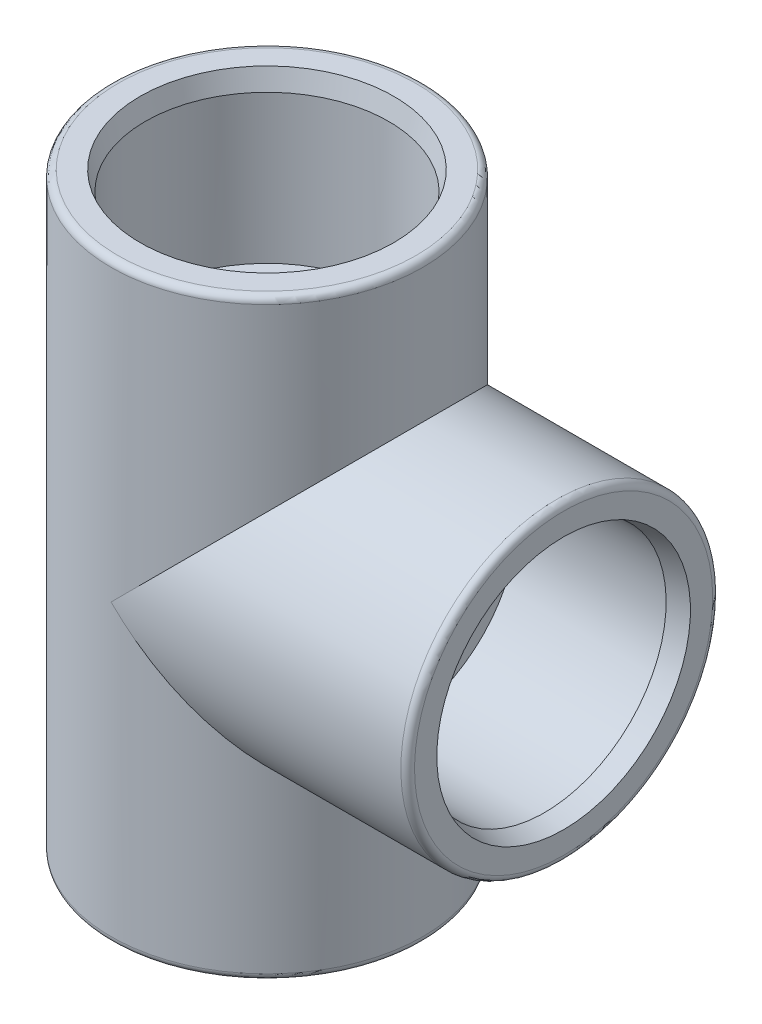
ISO-10303-21;
HEADER;
FILE_DESCRIPTION(('STEP AP214'),'2;1');
FILE_NAME('part.step','',(''),(''),'','','');
FILE_SCHEMA(('AUTOMOTIVE_DESIGN { 1 0 10303 214 1 1 1 1 }'));
ENDSEC;
DATA;
#1=APPLICATION_CONTEXT('core data for automotive mechanical design processes');
#2=APPLICATION_PROTOCOL_DEFINITION('international standard','automotive_design',2000,#1);
#3=PRODUCT_CONTEXT('',#1,'mechanical');
#4=PRODUCT('Part','Part','',(#3));
#5=PRODUCT_RELATED_PRODUCT_CATEGORY('part','',(#4));
#6=PRODUCT_DEFINITION_FORMATION('','',#4);
#7=PRODUCT_DEFINITION_CONTEXT('part definition',#1,'design');
#8=PRODUCT_DEFINITION('design','',#6,#7);
#9=PRODUCT_DEFINITION_SHAPE('','',#8);
#10=(LENGTH_UNIT() NAMED_UNIT(*) SI_UNIT(.MILLI.,.METRE.));
#11=(NAMED_UNIT(*) PLANE_ANGLE_UNIT() SI_UNIT($,.RADIAN.));
#12=(NAMED_UNIT(*) SI_UNIT($,.STERADIAN.) SOLID_ANGLE_UNIT());
#13=UNCERTAINTY_MEASURE_WITH_UNIT(LENGTH_MEASURE(1.E-05),#10,'distance_accuracy_value','');
#14=(GEOMETRIC_REPRESENTATION_CONTEXT(3) GLOBAL_UNCERTAINTY_ASSIGNED_CONTEXT((#13)) GLOBAL_UNIT_ASSIGNED_CONTEXT((#10,
#11,#12)) REPRESENTATION_CONTEXT('',''));
#15=CARTESIAN_POINT('',(0.,0.,0.));
#16=DIRECTION('',(0.,0.,1.));
#17=DIRECTION('',(1.,0.,0.));
#18=AXIS2_PLACEMENT_3D('',#15,#16,#17);
#19=CARTESIAN_POINT('',(0.,78.,0.));
#20=DIRECTION('',(0.,1.,0.));
#21=DIRECTION('',(1.,0.,0.));
#22=AXIS2_PLACEMENT_3D('',#19,#20,#21);
#23=PLANE('',#22);
#24=CARTESIAN_POINT('',(0.,78.,0.));
#25=DIRECTION('',(0.,1.,0.));
#26=DIRECTION('',(1.,0.,0.));
#27=AXIS2_PLACEMENT_3D('',#24,#25,#26);
#28=CIRCLE('',#27,19.6);
#29=CARTESIAN_POINT('',(19.6,78.,0.));
#30=VERTEX_POINT('',#29);
#31=EDGE_CURVE('E107',#30,#30,#28,.T.);
#32=ORIENTED_EDGE('',*,*,#31,.T.);
#33=EDGE_LOOP('',(#32));
#34=FACE_BOUND('',#33,.T.);
#35=CARTESIAN_POINT('',(0.,78.,0.));
#36=DIRECTION('',(0.,-1.,0.));
#37=DIRECTION('',(-1.,0.,0.));
#38=AXIS2_PLACEMENT_3D('',#35,#36,#37);
#39=CIRCLE('',#38,16.675);
#40=CARTESIAN_POINT('',(-16.675,78.,0.));
#41=VERTEX_POINT('',#40);
#42=EDGE_CURVE('E113',#41,#41,#39,.T.);
#43=ORIENTED_EDGE('',*,*,#42,.T.);
#44=EDGE_LOOP('',(#43));
#45=FACE_BOUND('',#44,.T.);
#46=ADVANCED_FACE('F16',(#34,#45),#23,.T.);
#47=CARTESIAN_POINT('',(0.,0.,0.));
#48=DIRECTION('',(0.,-1.,0.));
#49=DIRECTION('',(-1.,0.,0.));
#50=AXIS2_PLACEMENT_3D('',#47,#48,#49);
#51=PLANE('',#50);
#52=CARTESIAN_POINT('',(0.,0.,0.));
#53=DIRECTION('',(0.,-1.,0.));
#54=DIRECTION('',(-1.,0.,0.));
#55=AXIS2_PLACEMENT_3D('',#52,#53,#54);
#56=CIRCLE('',#55,19.6);
#57=CARTESIAN_POINT('',(-19.6,0.,0.));
#58=VERTEX_POINT('',#57);
#59=EDGE_CURVE('E74',#58,#58,#56,.T.);
#60=ORIENTED_EDGE('',*,*,#59,.T.);
#61=EDGE_LOOP('',(#60));
#62=FACE_BOUND('',#61,.T.);
#63=CARTESIAN_POINT('',(0.,0.,0.));
#64=DIRECTION('',(0.,1.,0.));
#65=DIRECTION('',(1.,0.,0.));
#66=AXIS2_PLACEMENT_3D('',#63,#64,#65);
#67=CIRCLE('',#66,16.675);
#68=CARTESIAN_POINT('',(16.675,0.,0.));
#69=VERTEX_POINT('',#68);
#70=EDGE_CURVE('E91',#69,#69,#67,.T.);
#71=ORIENTED_EDGE('',*,*,#70,.T.);
#72=EDGE_LOOP('',(#71));
#73=FACE_BOUND('',#72,.T.);
#74=ADVANCED_FACE('F75',(#62,#73),#51,.T.);
#75=CARTESIAN_POINT('',(39.,39.,0.));
#76=DIRECTION('',(1.,0.,0.));
#77=DIRECTION('',(0.,0.,-1.));
#78=AXIS2_PLACEMENT_3D('',#75,#76,#77);
#79=PLANE('',#78);
#80=CARTESIAN_POINT('',(39.,39.,0.));
#81=DIRECTION('',(1.,0.,0.));
#82=DIRECTION('',(0.,-1.,0.));
#83=AXIS2_PLACEMENT_3D('',#80,#81,#82);
#84=CIRCLE('',#83,19.6);
#85=CARTESIAN_POINT('',(39.,19.4,0.));
#86=VERTEX_POINT('',#85);
#87=EDGE_CURVE('E79',#86,#86,#84,.T.);
#88=ORIENTED_EDGE('',*,*,#87,.T.);
#89=EDGE_LOOP('',(#88));
#90=FACE_BOUND('',#89,.T.);
#91=CARTESIAN_POINT('',(39.,39.,0.));
#92=DIRECTION('',(-1.,0.,0.));
#93=DIRECTION('',(0.,1.,0.));
#94=AXIS2_PLACEMENT_3D('',#91,#92,#93);
#95=CIRCLE('',#94,16.675);
#96=CARTESIAN_POINT('',(39.,55.675,0.));
#97=VERTEX_POINT('',#96);
#98=EDGE_CURVE('E92',#97,#97,#95,.T.);
#99=ORIENTED_EDGE('',*,*,#98,.T.);
#100=EDGE_LOOP('',(#99));
#101=FACE_BOUND('',#100,.T.);
#102=ADVANCED_FACE('F146',(#90,#101),#79,.T.);
#103=CARTESIAN_POINT('',(0.,39.,0.));
#104=DIRECTION('',(0.,-1.,0.));
#105=DIRECTION('',(1.,0.,0.));
#106=AXIS2_PLACEMENT_3D('',#103,#104,#105);
#107=CYLINDRICAL_SURFACE('',#106,12.8);
#108=CARTESIAN_POINT('',(0.,22.,0.));
#109=DIRECTION('',(0.,-1.,0.));
#110=DIRECTION('',(1.,0.,0.));
#111=AXIS2_PLACEMENT_3D('',#108,#109,#110);
#112=CIRCLE('',#111,12.8);
#113=CARTESIAN_POINT('',(-12.8,22.,0.));
#114=VERTEX_POINT('',#113);
#115=EDGE_CURVE('E11',#114,#114,#112,.T.);
#116=ORIENTED_EDGE('',*,*,#115,.T.);
#117=EDGE_LOOP('',(#116));
#118=FACE_BOUND('',#117,.T.);
#119=CARTESIAN_POINT('',(0.,56.,0.));
#120=DIRECTION('',(0.,1.,0.));
#121=DIRECTION('',(1.,0.,0.));
#122=AXIS2_PLACEMENT_3D('',#119,#120,#121);
#123=CIRCLE('',#122,12.8);
#124=CARTESIAN_POINT('',(-12.8,56.,0.));
#125=VERTEX_POINT('',#124);
#126=EDGE_CURVE('E106',#125,#125,#123,.T.);
#127=ORIENTED_EDGE('',*,*,#126,.T.);
#128=EDGE_LOOP('',(#127));
#129=FACE_BOUND('',#128,.T.);
#130=CARTESIAN_POINT('',(0.,39.,0.));
#131=DIRECTION('',(0.707106781186548,-0.707106781186548,0.));
#132=DIRECTION('',(0.707106781186548,0.707106781186548,0.));
#133=AXIS2_PLACEMENT_3D('',#130,#131,#132);
#134=ELLIPSE('',#133,18.1019335983756,12.8);
#135=CARTESIAN_POINT('',(0.,39.,-12.8));
#136=VERTEX_POINT('',#135);
#137=CARTESIAN_POINT('',(0.,39.,12.8));
#138=VERTEX_POINT('',#137);
#139=EDGE_CURVE('E97',#136,#138,#134,.T.);
#140=ORIENTED_EDGE('',*,*,#139,.T.);
#141=CARTESIAN_POINT('',(0.,39.,0.));
#142=DIRECTION('',(0.707106781186548,0.707106781186548,0.));
#143=DIRECTION('',(-0.707106781186548,0.707106781186548,0.));
#144=AXIS2_PLACEMENT_3D('',#141,#142,#143);
#145=ELLIPSE('',#144,18.1019335983756,12.8);
#146=EDGE_CURVE('E100',#138,#136,#145,.T.);
#147=ORIENTED_EDGE('',*,*,#146,.T.);
#148=EDGE_LOOP('',(#140,#147));
#149=FACE_BOUND('',#148,.T.);
#150=ADVANCED_FACE('F153',(#118,#129,#149),#107,.F.);
#151=CARTESIAN_POINT('',(0.,22.,0.));
#152=DIRECTION('',(0.,1.,0.));
#153=DIRECTION('',(1.,0.,0.));
#154=AXIS2_PLACEMENT_3D('',#151,#152,#153);
#155=PLANE('',#154);
#156=CARTESIAN_POINT('',(0.,22.,0.));
#157=DIRECTION('',(0.,1.,0.));
#158=DIRECTION('',(1.,0.,0.));
#159=AXIS2_PLACEMENT_3D('',#156,#157,#158);
#160=CIRCLE('',#159,16.);
#161=CARTESIAN_POINT('',(16.,22.,0.));
#162=VERTEX_POINT('',#161);
#163=EDGE_CURVE('E26',#162,#162,#160,.T.);
#164=ORIENTED_EDGE('',*,*,#163,.F.);
#165=EDGE_LOOP('',(#164));
#166=FACE_BOUND('',#165,.T.);
#167=ORIENTED_EDGE('',*,*,#115,.F.);
#168=EDGE_LOOP('',(#167));
#169=FACE_BOUND('',#168,.T.);
#170=ADVANCED_FACE('F18',(#166,#169),#155,.F.);
#171=CARTESIAN_POINT('',(0.,10.5,0.));
#172=DIRECTION('',(0.,-1.,0.));
#173=DIRECTION('',(1.,0.,0.));
#174=AXIS2_PLACEMENT_3D('',#171,#172,#173);
#175=CYLINDRICAL_SURFACE('',#174,16.);
#176=ORIENTED_EDGE('',*,*,#163,.T.);
#177=EDGE_LOOP('',(#176));
#178=FACE_BOUND('',#177,.T.);
#179=CARTESIAN_POINT('',(0.,2.51913429510899,0.));
#180=DIRECTION('',(0.,-1.,0.));
#181=DIRECTION('',(1.,0.,0.));
#182=AXIS2_PLACEMENT_3D('',#179,#180,#181);
#183=CIRCLE('',#182,16.);
#184=CARTESIAN_POINT('',(16.,2.51913429510899,0.));
#185=VERTEX_POINT('',#184);
#186=EDGE_CURVE('E20',#185,#185,#183,.T.);
#187=ORIENTED_EDGE('',*,*,#186,.T.);
#188=EDGE_LOOP('',(#187));
#189=FACE_BOUND('',#188,.T.);
#190=ADVANCED_FACE('F133',(#178,#189),#175,.F.);
#191=CARTESIAN_POINT('',(0.,56.,0.));
#192=DIRECTION('',(0.,-1.,0.));
#193=DIRECTION('',(-1.,0.,0.));
#194=AXIS2_PLACEMENT_3D('',#191,#192,#193);
#195=PLANE('',#194);
#196=CARTESIAN_POINT('',(0.,56.,0.));
#197=DIRECTION('',(0.,-1.,0.));
#198=DIRECTION('',(1.,0.,0.));
#199=AXIS2_PLACEMENT_3D('',#196,#197,#198);
#200=CIRCLE('',#199,16.);
#201=CARTESIAN_POINT('',(16.,56.,0.));
#202=VERTEX_POINT('',#201);
#203=EDGE_CURVE('E119',#202,#202,#200,.T.);
#204=ORIENTED_EDGE('',*,*,#203,.F.);
#205=EDGE_LOOP('',(#204));
#206=FACE_BOUND('',#205,.T.);
#207=ORIENTED_EDGE('',*,*,#126,.F.);
#208=EDGE_LOOP('',(#207));
#209=FACE_BOUND('',#208,.T.);
#210=ADVANCED_FACE('F181',(#206,#209),#195,.F.);
#211=CARTESIAN_POINT('',(0.,67.5,0.));
#212=DIRECTION('',(0.,-1.,0.));
#213=DIRECTION('',(1.,0.,0.));
#214=AXIS2_PLACEMENT_3D('',#211,#212,#213);
#215=CYLINDRICAL_SURFACE('',#214,16.);
#216=ORIENTED_EDGE('',*,*,#203,.T.);
#217=EDGE_LOOP('',(#216));
#218=FACE_BOUND('',#217,.T.);
#219=CARTESIAN_POINT('',(0.,75.480865704891,0.));
#220=DIRECTION('',(0.,1.,0.));
#221=DIRECTION('',(1.,0.,0.));
#222=AXIS2_PLACEMENT_3D('',#219,#220,#221);
#223=CIRCLE('',#222,16.);
#224=CARTESIAN_POINT('',(-16.,75.480865704891,0.));
#225=VERTEX_POINT('',#224);
#226=EDGE_CURVE('E103',#225,#225,#223,.T.);
#227=ORIENTED_EDGE('',*,*,#226,.T.);
#228=EDGE_LOOP('',(#227));
#229=FACE_BOUND('',#228,.T.);
#230=ADVANCED_FACE('F184',(#218,#229),#215,.F.);
#231=CARTESIAN_POINT('',(19.5,39.,0.));
#232=DIRECTION('',(-1.,0.,0.));
#233=DIRECTION('',(0.,0.,-1.));
#234=AXIS2_PLACEMENT_3D('',#231,#232,#233);
#235=CYLINDRICAL_SURFACE('',#234,12.8);
#236=ORIENTED_EDGE('',*,*,#139,.F.);
#237=ORIENTED_EDGE('',*,*,#146,.F.);
#238=EDGE_LOOP('',(#236,#237));
#239=FACE_BOUND('',#238,.T.);
#240=CARTESIAN_POINT('',(17.,39.,0.));
#241=DIRECTION('',(1.,0.,0.));
#242=DIRECTION('',(0.,0.,-1.));
#243=AXIS2_PLACEMENT_3D('',#240,#241,#242);
#244=CIRCLE('',#243,12.8);
#245=CARTESIAN_POINT('',(17.,39.,12.8));
#246=VERTEX_POINT('',#245);
#247=EDGE_CURVE('E81',#246,#246,#244,.T.);
#248=ORIENTED_EDGE('',*,*,#247,.T.);
#249=EDGE_LOOP('',(#248));
#250=FACE_BOUND('',#249,.T.);
#251=ADVANCED_FACE('F179',(#239,#250),#235,.F.);
#252=CARTESIAN_POINT('',(17.,39.,0.));
#253=DIRECTION('',(-1.,0.,0.));
#254=DIRECTION('',(0.,0.,1.));
#255=AXIS2_PLACEMENT_3D('',#252,#253,#254);
#256=PLANE('',#255);
#257=CARTESIAN_POINT('',(17.,39.,0.));
#258=DIRECTION('',(-1.,0.,0.));
#259=DIRECTION('',(0.,0.,1.));
#260=AXIS2_PLACEMENT_3D('',#257,#258,#259);
#261=CIRCLE('',#260,16.);
#262=CARTESIAN_POINT('',(17.,39.,16.));
#263=VERTEX_POINT('',#262);
#264=EDGE_CURVE('E78',#263,#263,#261,.T.);
#265=ORIENTED_EDGE('',*,*,#264,.F.);
#266=EDGE_LOOP('',(#265));
#267=FACE_BOUND('',#266,.T.);
#268=ORIENTED_EDGE('',*,*,#247,.F.);
#269=EDGE_LOOP('',(#268));
#270=FACE_BOUND('',#269,.T.);
#271=ADVANCED_FACE('F175',(#267,#270),#256,.F.);
#272=CARTESIAN_POINT('',(28.5,39.,0.));
#273=DIRECTION('',(1.,0.,0.));
#274=DIRECTION('',(0.,0.,1.));
#275=AXIS2_PLACEMENT_3D('',#272,#273,#274);
#276=CYLINDRICAL_SURFACE('',#275,16.);
#277=ORIENTED_EDGE('',*,*,#264,.T.);
#278=EDGE_LOOP('',(#277));
#279=FACE_BOUND('',#278,.T.);
#280=CARTESIAN_POINT('',(36.480865704891,39.,0.));
#281=DIRECTION('',(1.,0.,0.));
#282=DIRECTION('',(0.,0.,1.));
#283=AXIS2_PLACEMENT_3D('',#280,#281,#282);
#284=CIRCLE('',#283,16.);
#285=CARTESIAN_POINT('',(36.480865704891,55.,0.));
#286=VERTEX_POINT('',#285);
#287=EDGE_CURVE('E88',#286,#286,#284,.T.);
#288=ORIENTED_EDGE('',*,*,#287,.T.);
#289=EDGE_LOOP('',(#288));
#290=FACE_BOUND('',#289,.T.);
#291=ADVANCED_FACE('F178',(#279,#290),#276,.F.);
#292=CARTESIAN_POINT('',(0.,0.9,0.));
#293=DIRECTION('',(0.,-1.,0.));
#294=DIRECTION('',(0.,0.,1.));
#295=AXIS2_PLACEMENT_3D('',#292,#293,#294);
#296=TOROIDAL_SURFACE('',#295,19.6,0.9);
#297=ORIENTED_EDGE('',*,*,#59,.F.);
#298=EDGE_LOOP('',(#297));
#299=FACE_BOUND('',#298,.T.);
#300=CARTESIAN_POINT('',(0.,0.9,0.));
#301=DIRECTION('',(0.,1.,0.));
#302=DIRECTION('',(1.,0.,0.));
#303=AXIS2_PLACEMENT_3D('',#300,#301,#302);
#304=CIRCLE('',#303,20.5);
#305=CARTESIAN_POINT('',(-20.5,0.9,0.));
#306=VERTEX_POINT('',#305);
#307=EDGE_CURVE('E95',#306,#306,#304,.T.);
#308=ORIENTED_EDGE('',*,*,#307,.F.);
#309=EDGE_LOOP('',(#308));
#310=FACE_BOUND('',#309,.T.);
#311=ADVANCED_FACE('F166',(#299,#310),#296,.T.);
#312=CARTESIAN_POINT('',(19.5,39.,0.));
#313=DIRECTION('',(-1.,0.,0.));
#314=DIRECTION('',(0.,0.,-1.));
#315=AXIS2_PLACEMENT_3D('',#312,#313,#314);
#316=CYLINDRICAL_SURFACE('',#315,20.5);
#317=CARTESIAN_POINT('',(38.1,39.,0.));
#318=DIRECTION('',(1.,0.,0.));
#319=DIRECTION('',(0.,0.,-1.));
#320=AXIS2_PLACEMENT_3D('',#317,#318,#319);
#321=CIRCLE('',#320,20.5);
#322=CARTESIAN_POINT('',(38.1,18.5,0.));
#323=VERTEX_POINT('',#322);
#324=EDGE_CURVE('E83',#323,#323,#321,.T.);
#325=ORIENTED_EDGE('',*,*,#324,.F.);
#326=EDGE_LOOP('',(#325));
#327=FACE_BOUND('',#326,.T.);
#328=CARTESIAN_POINT('',(0.,39.,0.));
#329=DIRECTION('',(-0.707106781186548,-0.707106781186548,0.));
#330=DIRECTION('',(-0.707106781186548,0.707106781186548,0.));
#331=AXIS2_PLACEMENT_3D('',#328,#329,#330);
#332=ELLIPSE('',#331,28.9913780286485,20.5);
#333=CARTESIAN_POINT('',(0.,39.,-20.5));
#334=VERTEX_POINT('',#333);
#335=CARTESIAN_POINT('',(0.,39.,20.5));
#336=VERTEX_POINT('',#335);
#337=EDGE_CURVE('E93',#334,#336,#332,.T.);
#338=ORIENTED_EDGE('',*,*,#337,.F.);
#339=CARTESIAN_POINT('',(0.,39.,0.));
#340=DIRECTION('',(-0.707106781186548,0.707106781186548,0.));
#341=DIRECTION('',(0.707106781186548,0.707106781186548,0.));
#342=AXIS2_PLACEMENT_3D('',#339,#340,#341);
#343=ELLIPSE('',#342,28.9913780286485,20.5);
#344=EDGE_CURVE('E87',#336,#334,#343,.T.);
#345=ORIENTED_EDGE('',*,*,#344,.F.);
#346=EDGE_LOOP('',(#338,#345));
#347=FACE_BOUND('',#346,.T.);
#348=ADVANCED_FACE('F162',(#327,#347),#316,.T.);
#349=CARTESIAN_POINT('',(38.1,39.,0.));
#350=DIRECTION('',(1.,0.,0.));
#351=DIRECTION('',(0.,0.,1.));
#352=AXIS2_PLACEMENT_3D('',#349,#350,#351);
#353=TOROIDAL_SURFACE('',#352,19.6,0.9);
#354=ORIENTED_EDGE('',*,*,#87,.F.);
#355=EDGE_LOOP('',(#354));
#356=FACE_BOUND('',#355,.T.);
#357=ORIENTED_EDGE('',*,*,#324,.T.);
#358=EDGE_LOOP('',(#357));
#359=FACE_BOUND('',#358,.T.);
#360=ADVANCED_FACE('F165',(#356,#359),#353,.T.);
#361=CARTESIAN_POINT('',(0.,39.,0.));
#362=DIRECTION('',(0.,-1.,0.));
#363=DIRECTION('',(1.,0.,0.));
#364=AXIS2_PLACEMENT_3D('',#361,#362,#363);
#365=CYLINDRICAL_SURFACE('',#364,20.5);
#366=CARTESIAN_POINT('',(0.,77.1,0.));
#367=DIRECTION('',(0.,1.,0.));
#368=DIRECTION('',(1.,0.,0.));
#369=AXIS2_PLACEMENT_3D('',#366,#367,#368);
#370=CIRCLE('',#369,20.5);
#371=CARTESIAN_POINT('',(20.5,77.1,0.));
#372=VERTEX_POINT('',#371);
#373=EDGE_CURVE('E108',#372,#372,#370,.T.);
#374=ORIENTED_EDGE('',*,*,#373,.F.);
#375=EDGE_LOOP('',(#374));
#376=FACE_BOUND('',#375,.T.);
#377=ORIENTED_EDGE('',*,*,#307,.T.);
#378=EDGE_LOOP('',(#377));
#379=FACE_BOUND('',#378,.T.);
#380=ORIENTED_EDGE('',*,*,#344,.T.);
#381=ORIENTED_EDGE('',*,*,#337,.T.);
#382=EDGE_LOOP('',(#380,#381));
#383=FACE_BOUND('',#382,.T.);
#384=ADVANCED_FACE('F173',(#376,#379,#383),#365,.T.);
#385=CARTESIAN_POINT('',(0.,77.1,0.));
#386=DIRECTION('',(0.,1.,0.));
#387=DIRECTION('',(0.,0.,1.));
#388=AXIS2_PLACEMENT_3D('',#385,#386,#387);
#389=TOROIDAL_SURFACE('',#388,19.6,0.9);
#390=ORIENTED_EDGE('',*,*,#31,.F.);
#391=EDGE_LOOP('',(#390));
#392=FACE_BOUND('',#391,.T.);
#393=ORIENTED_EDGE('',*,*,#373,.T.);
#394=EDGE_LOOP('',(#393));
#395=FACE_BOUND('',#394,.T.);
#396=ADVANCED_FACE('F140',(#392,#395),#389,.T.);
#397=CARTESIAN_POINT('',(0.,1.2595671475545,0.));
#398=DIRECTION('',(0.,-1.,0.));
#399=DIRECTION('',(1.,0.,0.));
#400=AXIS2_PLACEMENT_3D('',#397,#398,#399);
#401=CONICAL_SURFACE('',#400,16.3375,0.26179938779915);
#402=ORIENTED_EDGE('',*,*,#186,.F.);
#403=EDGE_LOOP('',(#402));
#404=FACE_BOUND('',#403,.T.);
#405=ORIENTED_EDGE('',*,*,#70,.F.);
#406=EDGE_LOOP('',(#405));
#407=FACE_BOUND('',#406,.T.);
#408=ADVANCED_FACE('F136',(#404,#407),#401,.F.);
#409=CARTESIAN_POINT('',(37.7404328524455,39.,0.));
#410=DIRECTION('',(1.,0.,0.));
#411=DIRECTION('',(0.,1.,0.));
#412=AXIS2_PLACEMENT_3D('',#409,#410,#411);
#413=CONICAL_SURFACE('',#412,16.3375,0.26179938779915);
#414=ORIENTED_EDGE('',*,*,#287,.F.);
#415=EDGE_LOOP('',(#414));
#416=FACE_BOUND('',#415,.T.);
#417=ORIENTED_EDGE('',*,*,#98,.F.);
#418=EDGE_LOOP('',(#417));
#419=FACE_BOUND('',#418,.T.);
#420=ADVANCED_FACE('F139',(#416,#419),#413,.F.);
#421=CARTESIAN_POINT('',(0.,76.7404328524455,0.));
#422=DIRECTION('',(0.,1.,0.));
#423=DIRECTION('',(-1.,0.,0.));
#424=AXIS2_PLACEMENT_3D('',#421,#422,#423);
#425=CONICAL_SURFACE('',#424,16.3375,0.26179938779915);
#426=ORIENTED_EDGE('',*,*,#226,.F.);
#427=EDGE_LOOP('',(#426));
#428=FACE_BOUND('',#427,.T.);
#429=ORIENTED_EDGE('',*,*,#42,.F.);
#430=EDGE_LOOP('',(#429));
#431=FACE_BOUND('',#430,.T.);
#432=ADVANCED_FACE('F160',(#428,#431),#425,.F.);
#433=CLOSED_SHELL('',(#46,#74,#102,#150,#170,#190,#210,#230,#251,#271,#291,#311,#348,#360,#384,
#396,#408,#420,#432));
#434=MANIFOLD_SOLID_BREP('B1',#433);
#435=ADVANCED_BREP_SHAPE_REPRESENTATION('',(#18,#434),#14);
#436=SHAPE_DEFINITION_REPRESENTATION(#9,#435);
ENDSEC;
END-ISO-10303-21;
